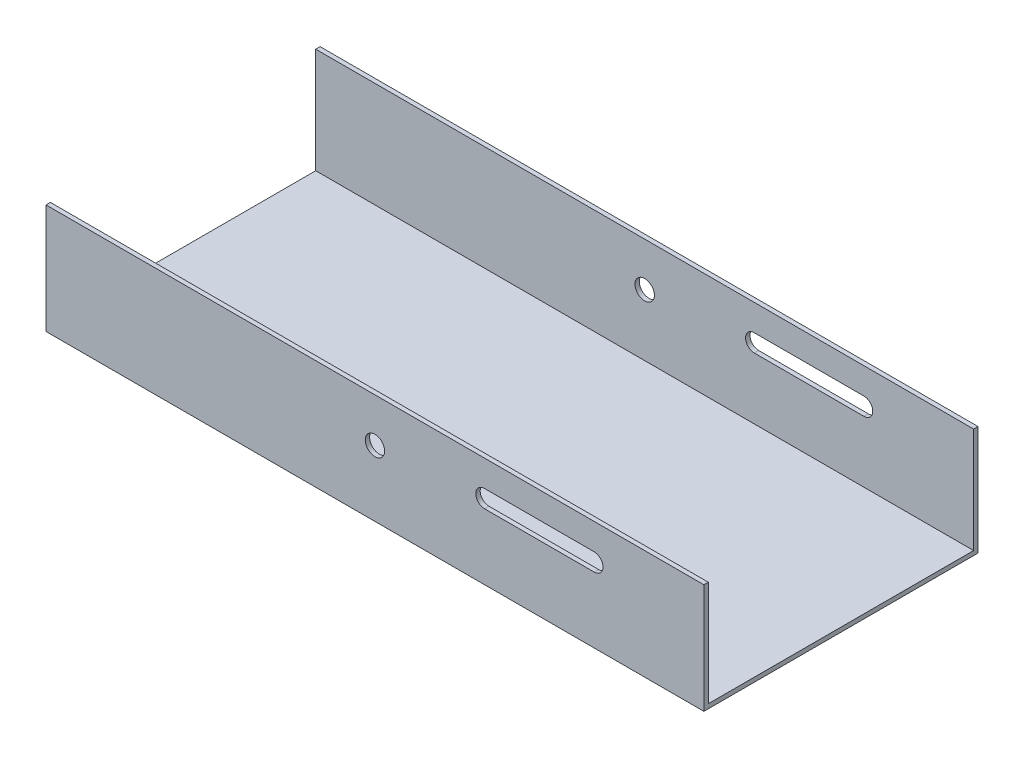
ISO-10303-21;
HEADER;
FILE_DESCRIPTION(('STEP AP214'),'2;1');
FILE_NAME('part.step','',(''),(''),'','','');
FILE_SCHEMA(('AUTOMOTIVE_DESIGN { 1 0 10303 214 1 1 1 1 }'));
ENDSEC;
DATA;
#1=APPLICATION_CONTEXT('core data for automotive mechanical design processes');
#2=APPLICATION_PROTOCOL_DEFINITION('international standard','automotive_design',2000,#1);
#3=PRODUCT_CONTEXT('',#1,'mechanical');
#4=PRODUCT('Part','Part','',(#3));
#5=PRODUCT_RELATED_PRODUCT_CATEGORY('part','',(#4));
#6=PRODUCT_DEFINITION_FORMATION('','',#4);
#7=PRODUCT_DEFINITION_CONTEXT('part definition',#1,'design');
#8=PRODUCT_DEFINITION('design','',#6,#7);
#9=PRODUCT_DEFINITION_SHAPE('','',#8);
#10=(LENGTH_UNIT() NAMED_UNIT(*) SI_UNIT(.MILLI.,.METRE.));
#11=(NAMED_UNIT(*) PLANE_ANGLE_UNIT() SI_UNIT($,.RADIAN.));
#12=(NAMED_UNIT(*) SI_UNIT($,.STERADIAN.) SOLID_ANGLE_UNIT());
#13=UNCERTAINTY_MEASURE_WITH_UNIT(LENGTH_MEASURE(1.E-05),#10,'distance_accuracy_value','');
#14=(GEOMETRIC_REPRESENTATION_CONTEXT(3) GLOBAL_UNCERTAINTY_ASSIGNED_CONTEXT((#13)) GLOBAL_UNIT_ASSIGNED_CONTEXT((#10,
#11,#12)) REPRESENTATION_CONTEXT('',''));
#15=CARTESIAN_POINT('',(0.,0.,0.));
#16=DIRECTION('',(0.,0.,1.));
#17=DIRECTION('',(1.,0.,0.));
#18=AXIS2_PLACEMENT_3D('',#15,#16,#17);
#19=CARTESIAN_POINT('',(0.,50.,0.));
#20=DIRECTION('',(0.,1.,0.));
#21=DIRECTION('',(0.,0.,1.));
#22=AXIS2_PLACEMENT_3D('',#19,#20,#21);
#23=PLANE('',#22);
#24=DIRECTION('',(-1.,0.,0.));
#25=VECTOR('',#24,1.);
#26=CARTESIAN_POINT('',(0.,50.,-123.));
#27=LINE('',#26,#25);
#28=CARTESIAN_POINT('',(0.,50.,-123.));
#29=VERTEX_POINT('',#28);
#30=CARTESIAN_POINT('',(-300.,50.,-123.));
#31=VERTEX_POINT('',#30);
#32=EDGE_CURVE('E212',#29,#31,#27,.T.);
#33=ORIENTED_EDGE('',*,*,#32,.F.);
#34=DIRECTION('',(0.,0.,-1.));
#35=VECTOR('',#34,1.);
#36=CARTESIAN_POINT('',(0.,50.,0.));
#37=LINE('',#36,#35);
#38=CARTESIAN_POINT('',(0.,50.,-125.));
#39=VERTEX_POINT('',#38);
#40=EDGE_CURVE('E236',#29,#39,#37,.T.);
#41=ORIENTED_EDGE('',*,*,#40,.T.);
#42=DIRECTION('',(-1.,0.,0.));
#43=VECTOR('',#42,1.);
#44=CARTESIAN_POINT('',(0.,50.,-125.));
#45=LINE('',#44,#43);
#46=CARTESIAN_POINT('',(-300.,50.,-125.));
#47=VERTEX_POINT('',#46);
#48=EDGE_CURVE('E235',#39,#47,#45,.T.);
#49=ORIENTED_EDGE('',*,*,#48,.T.);
#50=DIRECTION('',(0.,0.,1.));
#51=VECTOR('',#50,1.);
#52=CARTESIAN_POINT('',(-300.,50.,0.));
#53=LINE('',#52,#51);
#54=EDGE_CURVE('E239',#47,#31,#53,.T.);
#55=ORIENTED_EDGE('',*,*,#54,.T.);
#56=EDGE_LOOP('',(#33,#41,#49,#55));
#57=FACE_BOUND('',#56,.T.);
#58=ADVANCED_FACE('F37',(#57),#23,.T.);
#59=CARTESIAN_POINT('',(0.,50.,0.));
#60=DIRECTION('',(-1.,0.,0.));
#61=DIRECTION('',(0.,0.,1.));
#62=AXIS2_PLACEMENT_3D('',#59,#60,#61);
#63=PLANE('',#62);
#64=ORIENTED_EDGE('',*,*,#40,.F.);
#65=DIRECTION('',(0.,-1.,0.));
#66=VECTOR('',#65,1.);
#67=CARTESIAN_POINT('',(0.,50.,-123.));
#68=LINE('',#67,#66);
#69=CARTESIAN_POINT('',(0.,2.,-123.));
#70=VERTEX_POINT('',#69);
#71=EDGE_CURVE('E216',#29,#70,#68,.T.);
#72=ORIENTED_EDGE('',*,*,#71,.T.);
#73=DIRECTION('',(0.,0.,-1.));
#74=VECTOR('',#73,1.);
#75=CARTESIAN_POINT('',(0.,2.,0.));
#76=LINE('',#75,#74);
#77=CARTESIAN_POINT('',(0.,2.,-2.));
#78=VERTEX_POINT('',#77);
#79=EDGE_CURVE('E206',#78,#70,#76,.T.);
#80=ORIENTED_EDGE('',*,*,#79,.F.);
#81=DIRECTION('',(0.,-1.,0.));
#82=VECTOR('',#81,1.);
#83=CARTESIAN_POINT('',(0.,50.,-2.));
#84=LINE('',#83,#82);
#85=CARTESIAN_POINT('',(0.,50.,-2.));
#86=VERTEX_POINT('',#85);
#87=EDGE_CURVE('E221',#86,#78,#84,.T.);
#88=ORIENTED_EDGE('',*,*,#87,.F.);
#89=CARTESIAN_POINT('',(0.,50.,0.));
#90=VERTEX_POINT('',#89);
#91=EDGE_CURVE('E232',#90,#86,#37,.T.);
#92=ORIENTED_EDGE('',*,*,#91,.F.);
#93=DIRECTION('',(0.,-1.,0.));
#94=VECTOR('',#93,1.);
#95=CARTESIAN_POINT('',(0.,50.,0.));
#96=LINE('',#95,#94);
#97=CARTESIAN_POINT('',(0.,0.,0.));
#98=VERTEX_POINT('',#97);
#99=EDGE_CURVE('E244',#90,#98,#96,.T.);
#100=ORIENTED_EDGE('',*,*,#99,.T.);
#101=DIRECTION('',(0.,0.,-1.));
#102=VECTOR('',#101,1.);
#103=CARTESIAN_POINT('',(0.,0.,0.));
#104=LINE('',#103,#102);
#105=CARTESIAN_POINT('',(0.,0.,-125.));
#106=VERTEX_POINT('',#105);
#107=EDGE_CURVE('E230',#98,#106,#104,.T.);
#108=ORIENTED_EDGE('',*,*,#107,.T.);
#109=DIRECTION('',(0.,-1.,0.));
#110=VECTOR('',#109,1.);
#111=CARTESIAN_POINT('',(0.,50.,-125.));
#112=LINE('',#111,#110);
#113=EDGE_CURVE('E261',#39,#106,#112,.T.);
#114=ORIENTED_EDGE('',*,*,#113,.F.);
#115=EDGE_LOOP('',(#64,#72,#80,#88,#92,#100,#108,#114));
#116=FACE_BOUND('',#115,.T.);
#117=ADVANCED_FACE('F39',(#116),#63,.F.);
#118=CARTESIAN_POINT('',(0.,50.,-125.));
#119=DIRECTION('',(0.,0.,1.));
#120=DIRECTION('',(1.,0.,0.));
#121=AXIS2_PLACEMENT_3D('',#118,#119,#120);
#122=PLANE('',#121);
#123=CARTESIAN_POINT('',(-150.,30.,-125.));
#124=DIRECTION('',(0.,0.,1.));
#125=DIRECTION('',(1.,0.,0.));
#126=AXIS2_PLACEMENT_3D('',#123,#124,#125);
#127=CIRCLE('',#126,4.42375783482208);
#128=CARTESIAN_POINT('',(-145.576242165178,30.,-125.));
#129=VERTEX_POINT('',#128);
#130=EDGE_CURVE('E276',#129,#129,#127,.T.);
#131=ORIENTED_EDGE('',*,*,#130,.T.);
#132=EDGE_LOOP('',(#131));
#133=FACE_BOUND('',#132,.T.);
#134=DIRECTION('',(-1.,0.,0.));
#135=VECTOR('',#134,1.);
#136=CARTESIAN_POINT('',(0.,38.,-125.));
#137=LINE('',#136,#135);
#138=CARTESIAN_POINT('',(-50.,38.,-125.));
#139=VERTEX_POINT('',#138);
#140=CARTESIAN_POINT('',(-100.,38.,-125.));
#141=VERTEX_POINT('',#140);
#142=EDGE_CURVE('E197',#139,#141,#137,.T.);
#143=ORIENTED_EDGE('',*,*,#142,.T.);
#144=CARTESIAN_POINT('',(-100.,34.,-125.));
#145=DIRECTION('',(0.,0.,1.));
#146=DIRECTION('',(1.,0.,0.));
#147=AXIS2_PLACEMENT_3D('',#144,#145,#146);
#148=CIRCLE('',#147,4.00000000000001);
#149=CARTESIAN_POINT('',(-100.,30.,-125.));
#150=VERTEX_POINT('',#149);
#151=EDGE_CURVE('E203',#141,#150,#148,.T.);
#152=ORIENTED_EDGE('',*,*,#151,.T.);
#153=DIRECTION('',(1.,0.,0.));
#154=VECTOR('',#153,1.);
#155=CARTESIAN_POINT('',(0.,30.,-125.));
#156=LINE('',#155,#154);
#157=CARTESIAN_POINT('',(-50.,30.,-125.));
#158=VERTEX_POINT('',#157);
#159=EDGE_CURVE('E187',#150,#158,#156,.T.);
#160=ORIENTED_EDGE('',*,*,#159,.T.);
#161=CARTESIAN_POINT('',(-50.,34.,-125.));
#162=DIRECTION('',(0.,0.,1.));
#163=DIRECTION('',(1.,0.,0.));
#164=AXIS2_PLACEMENT_3D('',#161,#162,#163);
#165=CIRCLE('',#164,4.00000000000001);
#166=EDGE_CURVE('E192',#158,#139,#165,.T.);
#167=ORIENTED_EDGE('',*,*,#166,.T.);
#168=EDGE_LOOP('',(#143,#152,#160,#167));
#169=FACE_BOUND('',#168,.T.);
#170=DIRECTION('',(-1.,0.,0.));
#171=VECTOR('',#170,1.);
#172=CARTESIAN_POINT('',(0.,0.,-125.));
#173=LINE('',#172,#171);
#174=CARTESIAN_POINT('',(-300.,0.,-125.));
#175=VERTEX_POINT('',#174);
#176=EDGE_CURVE('E247',#106,#175,#173,.T.);
#177=ORIENTED_EDGE('',*,*,#176,.T.);
#178=DIRECTION('',(0.,-1.,0.));
#179=VECTOR('',#178,1.);
#180=CARTESIAN_POINT('',(-300.,50.,-125.));
#181=LINE('',#180,#179);
#182=EDGE_CURVE('E258',#47,#175,#181,.T.);
#183=ORIENTED_EDGE('',*,*,#182,.F.);
#184=ORIENTED_EDGE('',*,*,#48,.F.);
#185=ORIENTED_EDGE('',*,*,#113,.T.);
#186=EDGE_LOOP('',(#177,#183,#184,#185));
#187=FACE_BOUND('',#186,.T.);
#188=ADVANCED_FACE('F312',(#133,#169,#187),#122,.F.);
#189=CARTESIAN_POINT('',(-300.,50.,0.));
#190=DIRECTION('',(1.,0.,0.));
#191=DIRECTION('',(0.,0.,-1.));
#192=AXIS2_PLACEMENT_3D('',#189,#190,#191);
#193=PLANE('',#192);
#194=CARTESIAN_POINT('',(-300.,50.,-2.));
#195=VERTEX_POINT('',#194);
#196=CARTESIAN_POINT('',(-300.,50.,0.));
#197=VERTEX_POINT('',#196);
#198=EDGE_CURVE('E238',#195,#197,#53,.T.);
#199=ORIENTED_EDGE('',*,*,#198,.F.);
#200=DIRECTION('',(0.,-1.,0.));
#201=VECTOR('',#200,1.);
#202=CARTESIAN_POINT('',(-300.,50.,-2.));
#203=LINE('',#202,#201);
#204=CARTESIAN_POINT('',(-300.,2.,-2.));
#205=VERTEX_POINT('',#204);
#206=EDGE_CURVE('E217',#195,#205,#203,.T.);
#207=ORIENTED_EDGE('',*,*,#206,.T.);
#208=DIRECTION('',(0.,0.,1.));
#209=VECTOR('',#208,1.);
#210=CARTESIAN_POINT('',(-300.,2.,0.));
#211=LINE('',#210,#209);
#212=CARTESIAN_POINT('',(-300.,2.,-123.));
#213=VERTEX_POINT('',#212);
#214=EDGE_CURVE('E209',#213,#205,#211,.T.);
#215=ORIENTED_EDGE('',*,*,#214,.F.);
#216=DIRECTION('',(0.,-1.,0.));
#217=VECTOR('',#216,1.);
#218=CARTESIAN_POINT('',(-300.,50.,-123.));
#219=LINE('',#218,#217);
#220=EDGE_CURVE('E213',#31,#213,#219,.T.);
#221=ORIENTED_EDGE('',*,*,#220,.F.);
#222=ORIENTED_EDGE('',*,*,#54,.F.);
#223=ORIENTED_EDGE('',*,*,#182,.T.);
#224=DIRECTION('',(0.,0.,1.));
#225=VECTOR('',#224,1.);
#226=CARTESIAN_POINT('',(-300.,0.,0.));
#227=LINE('',#226,#225);
#228=CARTESIAN_POINT('',(-300.,0.,0.));
#229=VERTEX_POINT('',#228);
#230=EDGE_CURVE('E249',#175,#229,#227,.T.);
#231=ORIENTED_EDGE('',*,*,#230,.T.);
#232=DIRECTION('',(0.,-1.,0.));
#233=VECTOR('',#232,1.);
#234=CARTESIAN_POINT('',(-300.,50.,0.));
#235=LINE('',#234,#233);
#236=EDGE_CURVE('E255',#197,#229,#235,.T.);
#237=ORIENTED_EDGE('',*,*,#236,.F.);
#238=EDGE_LOOP('',(#199,#207,#215,#221,#222,#223,#231,#237));
#239=FACE_BOUND('',#238,.T.);
#240=ADVANCED_FACE('F323',(#239),#193,.F.);
#241=CARTESIAN_POINT('',(0.,50.,0.));
#242=DIRECTION('',(0.,0.,-1.));
#243=DIRECTION('',(-1.,0.,0.));
#244=AXIS2_PLACEMENT_3D('',#241,#242,#243);
#245=PLANE('',#244);
#246=CARTESIAN_POINT('',(-150.,30.,0.));
#247=DIRECTION('',(0.,0.,1.));
#248=DIRECTION('',(1.,0.,0.));
#249=AXIS2_PLACEMENT_3D('',#246,#247,#248);
#250=CIRCLE('',#249,4.42375783482208);
#251=CARTESIAN_POINT('',(-145.576242165178,30.,0.));
#252=VERTEX_POINT('',#251);
#253=EDGE_CURVE('E283',#252,#252,#250,.T.);
#254=ORIENTED_EDGE('',*,*,#253,.F.);
#255=EDGE_LOOP('',(#254));
#256=FACE_BOUND('',#255,.T.);
#257=DIRECTION('',(1.,0.,0.));
#258=VECTOR('',#257,1.);
#259=CARTESIAN_POINT('',(-100.,30.,0.));
#260=LINE('',#259,#258);
#261=CARTESIAN_POINT('',(-100.,30.,0.));
#262=VERTEX_POINT('',#261);
#263=CARTESIAN_POINT('',(-50.,30.,0.));
#264=VERTEX_POINT('',#263);
#265=EDGE_CURVE('E165',#262,#264,#260,.T.);
#266=ORIENTED_EDGE('',*,*,#265,.F.);
#267=CARTESIAN_POINT('',(-100.,34.,0.));
#268=DIRECTION('',(0.,0.,1.));
#269=DIRECTION('',(1.,0.,0.));
#270=AXIS2_PLACEMENT_3D('',#267,#268,#269);
#271=CIRCLE('',#270,4.00000000000001);
#272=CARTESIAN_POINT('',(-100.,38.,0.));
#273=VERTEX_POINT('',#272);
#274=EDGE_CURVE('E61',#273,#262,#271,.T.);
#275=ORIENTED_EDGE('',*,*,#274,.F.);
#276=DIRECTION('',(-1.,0.,0.));
#277=VECTOR('',#276,1.);
#278=CARTESIAN_POINT('',(-100.,38.,0.));
#279=LINE('',#278,#277);
#280=CARTESIAN_POINT('',(-50.,38.,0.));
#281=VERTEX_POINT('',#280);
#282=EDGE_CURVE('E173',#281,#273,#279,.T.);
#283=ORIENTED_EDGE('',*,*,#282,.F.);
#284=CARTESIAN_POINT('',(-50.,34.,0.));
#285=DIRECTION('',(0.,0.,1.));
#286=DIRECTION('',(1.,0.,0.));
#287=AXIS2_PLACEMENT_3D('',#284,#285,#286);
#288=CIRCLE('',#287,4.00000000000001);
#289=EDGE_CURVE('E156',#264,#281,#288,.T.);
#290=ORIENTED_EDGE('',*,*,#289,.F.);
#291=EDGE_LOOP('',(#266,#275,#283,#290));
#292=FACE_BOUND('',#291,.T.);
#293=DIRECTION('',(1.,0.,0.));
#294=VECTOR('',#293,1.);
#295=CARTESIAN_POINT('',(0.,0.,0.));
#296=LINE('',#295,#294);
#297=EDGE_CURVE('E251',#229,#98,#296,.T.);
#298=ORIENTED_EDGE('',*,*,#297,.T.);
#299=ORIENTED_EDGE('',*,*,#99,.F.);
#300=DIRECTION('',(1.,0.,0.));
#301=VECTOR('',#300,1.);
#302=CARTESIAN_POINT('',(0.,50.,0.));
#303=LINE('',#302,#301);
#304=EDGE_CURVE('E242',#197,#90,#303,.T.);
#305=ORIENTED_EDGE('',*,*,#304,.F.);
#306=ORIENTED_EDGE('',*,*,#236,.T.);
#307=EDGE_LOOP('',(#298,#299,#305,#306));
#308=FACE_BOUND('',#307,.T.);
#309=ADVANCED_FACE('F170',(#256,#292,#308),#245,.F.);
#310=DIRECTION('',(1.,0.,0.));
#311=VECTOR('',#310,1.);
#312=CARTESIAN_POINT('',(0.,50.,-2.));
#313=LINE('',#312,#311);
#314=EDGE_CURVE('E222',#195,#86,#313,.T.);
#315=ORIENTED_EDGE('',*,*,#314,.F.);
#316=ORIENTED_EDGE('',*,*,#198,.T.);
#317=ORIENTED_EDGE('',*,*,#304,.T.);
#318=ORIENTED_EDGE('',*,*,#91,.T.);
#319=EDGE_LOOP('',(#315,#316,#317,#318));
#320=FACE_BOUND('',#319,.T.);
#321=ADVANCED_FACE('F308',(#320),#23,.T.);
#322=CARTESIAN_POINT('',(0.,0.,0.));
#323=DIRECTION('',(0.,1.,0.));
#324=DIRECTION('',(0.,0.,1.));
#325=AXIS2_PLACEMENT_3D('',#322,#323,#324);
#326=PLANE('',#325);
#327=ORIENTED_EDGE('',*,*,#107,.F.);
#328=ORIENTED_EDGE('',*,*,#297,.F.);
#329=ORIENTED_EDGE('',*,*,#230,.F.);
#330=ORIENTED_EDGE('',*,*,#176,.F.);
#331=EDGE_LOOP('',(#327,#328,#329,#330));
#332=FACE_BOUND('',#331,.T.);
#333=ADVANCED_FACE('F302',(#332),#326,.F.);
#334=CARTESIAN_POINT('',(0.,50.,-123.));
#335=DIRECTION('',(0.,0.,1.));
#336=DIRECTION('',(1.,0.,0.));
#337=AXIS2_PLACEMENT_3D('',#334,#335,#336);
#338=PLANE('',#337);
#339=CARTESIAN_POINT('',(-150.,30.,-123.));
#340=DIRECTION('',(0.,0.,1.));
#341=DIRECTION('',(1.,0.,0.));
#342=AXIS2_PLACEMENT_3D('',#339,#340,#341);
#343=CIRCLE('',#342,4.42375783482208);
#344=CARTESIAN_POINT('',(-145.576242165178,30.,-123.));
#345=VERTEX_POINT('',#344);
#346=EDGE_CURVE('E278',#345,#345,#343,.T.);
#347=ORIENTED_EDGE('',*,*,#346,.F.);
#348=EDGE_LOOP('',(#347));
#349=FACE_BOUND('',#348,.T.);
#350=CARTESIAN_POINT('',(-100.,34.,-123.));
#351=DIRECTION('',(0.,0.,1.));
#352=DIRECTION('',(1.,0.,0.));
#353=AXIS2_PLACEMENT_3D('',#350,#351,#352);
#354=CIRCLE('',#353,4.00000000000001);
#355=CARTESIAN_POINT('',(-100.,38.,-123.));
#356=VERTEX_POINT('',#355);
#357=CARTESIAN_POINT('',(-100.,30.,-123.));
#358=VERTEX_POINT('',#357);
#359=EDGE_CURVE('E200',#356,#358,#354,.T.);
#360=ORIENTED_EDGE('',*,*,#359,.F.);
#361=DIRECTION('',(-1.,0.,0.));
#362=VECTOR('',#361,1.);
#363=CARTESIAN_POINT('',(0.,38.,-123.));
#364=LINE('',#363,#362);
#365=CARTESIAN_POINT('',(-50.,38.,-123.));
#366=VERTEX_POINT('',#365);
#367=EDGE_CURVE('E195',#366,#356,#364,.T.);
#368=ORIENTED_EDGE('',*,*,#367,.F.);
#369=CARTESIAN_POINT('',(-50.,34.,-123.));
#370=DIRECTION('',(0.,0.,1.));
#371=DIRECTION('',(1.,0.,0.));
#372=AXIS2_PLACEMENT_3D('',#369,#370,#371);
#373=CIRCLE('',#372,4.00000000000001);
#374=CARTESIAN_POINT('',(-50.,30.,-123.));
#375=VERTEX_POINT('',#374);
#376=EDGE_CURVE('E190',#375,#366,#373,.T.);
#377=ORIENTED_EDGE('',*,*,#376,.F.);
#378=DIRECTION('',(1.,0.,0.));
#379=VECTOR('',#378,1.);
#380=CARTESIAN_POINT('',(0.,30.,-123.));
#381=LINE('',#380,#379);
#382=EDGE_CURVE('E185',#358,#375,#381,.T.);
#383=ORIENTED_EDGE('',*,*,#382,.F.);
#384=EDGE_LOOP('',(#360,#368,#377,#383));
#385=FACE_BOUND('',#384,.T.);
#386=DIRECTION('',(-1.,0.,0.));
#387=VECTOR('',#386,1.);
#388=CARTESIAN_POINT('',(0.,2.,-123.));
#389=LINE('',#388,#387);
#390=EDGE_CURVE('E207',#70,#213,#389,.T.);
#391=ORIENTED_EDGE('',*,*,#390,.F.);
#392=ORIENTED_EDGE('',*,*,#71,.F.);
#393=ORIENTED_EDGE('',*,*,#32,.T.);
#394=ORIENTED_EDGE('',*,*,#220,.T.);
#395=EDGE_LOOP('',(#391,#392,#393,#394));
#396=FACE_BOUND('',#395,.T.);
#397=ADVANCED_FACE('F294',(#349,#385,#396),#338,.T.);
#398=CARTESIAN_POINT('',(0.,50.,-2.));
#399=DIRECTION('',(0.,0.,-1.));
#400=DIRECTION('',(-1.,0.,0.));
#401=AXIS2_PLACEMENT_3D('',#398,#399,#400);
#402=PLANE('',#401);
#403=CARTESIAN_POINT('',(-150.,30.,-2.));
#404=DIRECTION('',(0.,0.,-1.));
#405=DIRECTION('',(-1.,0.,0.));
#406=AXIS2_PLACEMENT_3D('',#403,#404,#405);
#407=CIRCLE('',#406,4.42375783482208);
#408=CARTESIAN_POINT('',(-154.423757834822,30.,-2.));
#409=VERTEX_POINT('',#408);
#410=EDGE_CURVE('E41',#409,#409,#407,.T.);
#411=ORIENTED_EDGE('',*,*,#410,.F.);
#412=EDGE_LOOP('',(#411));
#413=FACE_BOUND('',#412,.T.);
#414=CARTESIAN_POINT('',(-100.,34.,-2.));
#415=DIRECTION('',(0.,0.,-1.));
#416=DIRECTION('',(-1.,0.,0.));
#417=AXIS2_PLACEMENT_3D('',#414,#415,#416);
#418=CIRCLE('',#417,4.00000000000001);
#419=CARTESIAN_POINT('',(-100.,30.,-2.));
#420=VERTEX_POINT('',#419);
#421=CARTESIAN_POINT('',(-100.,38.,-2.));
#422=VERTEX_POINT('',#421);
#423=EDGE_CURVE('E11',#420,#422,#418,.T.);
#424=ORIENTED_EDGE('',*,*,#423,.F.);
#425=DIRECTION('',(-1.,0.,0.));
#426=VECTOR('',#425,1.);
#427=CARTESIAN_POINT('',(0.,30.,-2.));
#428=LINE('',#427,#426);
#429=CARTESIAN_POINT('',(-50.,30.,-2.));
#430=VERTEX_POINT('',#429);
#431=EDGE_CURVE('E264',#430,#420,#428,.T.);
#432=ORIENTED_EDGE('',*,*,#431,.F.);
#433=CARTESIAN_POINT('',(-50.,34.,-2.));
#434=DIRECTION('',(0.,0.,-1.));
#435=DIRECTION('',(-1.,0.,0.));
#436=AXIS2_PLACEMENT_3D('',#433,#434,#435);
#437=CIRCLE('',#436,4.00000000000001);
#438=CARTESIAN_POINT('',(-50.,38.,-2.));
#439=VERTEX_POINT('',#438);
#440=EDGE_CURVE('E159',#439,#430,#437,.T.);
#441=ORIENTED_EDGE('',*,*,#440,.F.);
#442=DIRECTION('',(1.,0.,0.));
#443=VECTOR('',#442,1.);
#444=CARTESIAN_POINT('',(0.,38.,-2.));
#445=LINE('',#444,#443);
#446=EDGE_CURVE('E46',#422,#439,#445,.T.);
#447=ORIENTED_EDGE('',*,*,#446,.F.);
#448=EDGE_LOOP('',(#424,#432,#441,#447));
#449=FACE_BOUND('',#448,.T.);
#450=DIRECTION('',(1.,0.,0.));
#451=VECTOR('',#450,1.);
#452=CARTESIAN_POINT('',(0.,2.,-2.));
#453=LINE('',#452,#451);
#454=EDGE_CURVE('E210',#205,#78,#453,.T.);
#455=ORIENTED_EDGE('',*,*,#454,.F.);
#456=ORIENTED_EDGE('',*,*,#206,.F.);
#457=ORIENTED_EDGE('',*,*,#314,.T.);
#458=ORIENTED_EDGE('',*,*,#87,.T.);
#459=EDGE_LOOP('',(#455,#456,#457,#458));
#460=FACE_BOUND('',#459,.T.);
#461=ADVANCED_FACE('F273',(#413,#449,#460),#402,.T.);
#462=CARTESIAN_POINT('',(0.,2.,0.));
#463=DIRECTION('',(0.,1.,0.));
#464=DIRECTION('',(0.,0.,1.));
#465=AXIS2_PLACEMENT_3D('',#462,#463,#464);
#466=PLANE('',#465);
#467=ORIENTED_EDGE('',*,*,#79,.T.);
#468=ORIENTED_EDGE('',*,*,#390,.T.);
#469=ORIENTED_EDGE('',*,*,#214,.T.);
#470=ORIENTED_EDGE('',*,*,#454,.T.);
#471=EDGE_LOOP('',(#467,#468,#469,#470));
#472=FACE_BOUND('',#471,.T.);
#473=ADVANCED_FACE('F293',(#472),#466,.T.);
#474=CARTESIAN_POINT('',(-100.,30.,-142.));
#475=DIRECTION('',(0.,-1.,0.));
#476=DIRECTION('',(0.,0.,-1.));
#477=AXIS2_PLACEMENT_3D('',#474,#475,#476);
#478=PLANE('',#477);
#479=ORIENTED_EDGE('',*,*,#431,.T.);
#480=DIRECTION('',(0.,0.,1.));
#481=VECTOR('',#480,1.);
#482=CARTESIAN_POINT('',(-100.,30.,-142.));
#483=LINE('',#482,#481);
#484=EDGE_CURVE('E167',#420,#262,#483,.T.);
#485=ORIENTED_EDGE('',*,*,#484,.T.);
#486=ORIENTED_EDGE('',*,*,#265,.T.);
#487=DIRECTION('',(0.,0.,1.));
#488=VECTOR('',#487,1.);
#489=CARTESIAN_POINT('',(-50.,30.,-142.));
#490=LINE('',#489,#488);
#491=EDGE_CURVE('E151',#430,#264,#490,.T.);
#492=ORIENTED_EDGE('',*,*,#491,.F.);
#493=EDGE_LOOP('',(#479,#485,#486,#492));
#494=FACE_BOUND('',#493,.T.);
#495=ADVANCED_FACE('F166',(#494),#478,.F.);
#496=CARTESIAN_POINT('',(-50.,34.,-142.));
#497=DIRECTION('',(0.,0.,1.));
#498=DIRECTION('',(1.,0.,0.));
#499=AXIS2_PLACEMENT_3D('',#496,#497,#498);
#500=CYLINDRICAL_SURFACE('',#499,4.00000000000001);
#501=ORIENTED_EDGE('',*,*,#440,.T.);
#502=ORIENTED_EDGE('',*,*,#491,.T.);
#503=ORIENTED_EDGE('',*,*,#289,.T.);
#504=DIRECTION('',(0.,0.,1.));
#505=VECTOR('',#504,1.);
#506=CARTESIAN_POINT('',(-50.,38.,-142.));
#507=LINE('',#506,#505);
#508=EDGE_CURVE('E182',#439,#281,#507,.T.);
#509=ORIENTED_EDGE('',*,*,#508,.F.);
#510=EDGE_LOOP('',(#501,#502,#503,#509));
#511=FACE_BOUND('',#510,.T.);
#512=ADVANCED_FACE('F153',(#511),#500,.F.);
#513=CARTESIAN_POINT('',(-100.,38.,-142.));
#514=DIRECTION('',(0.,1.,0.));
#515=DIRECTION('',(0.,0.,1.));
#516=AXIS2_PLACEMENT_3D('',#513,#514,#515);
#517=PLANE('',#516);
#518=ORIENTED_EDGE('',*,*,#446,.T.);
#519=ORIENTED_EDGE('',*,*,#508,.T.);
#520=ORIENTED_EDGE('',*,*,#282,.T.);
#521=DIRECTION('',(0.,0.,1.));
#522=VECTOR('',#521,1.);
#523=CARTESIAN_POINT('',(-100.,38.,-142.));
#524=LINE('',#523,#522);
#525=EDGE_CURVE('E178',#422,#273,#524,.T.);
#526=ORIENTED_EDGE('',*,*,#525,.F.);
#527=EDGE_LOOP('',(#518,#519,#520,#526));
#528=FACE_BOUND('',#527,.T.);
#529=ADVANCED_FACE('F270',(#528),#517,.F.);
#530=CARTESIAN_POINT('',(-100.,34.,-142.));
#531=DIRECTION('',(0.,0.,1.));
#532=DIRECTION('',(1.,0.,0.));
#533=AXIS2_PLACEMENT_3D('',#530,#531,#532);
#534=CYLINDRICAL_SURFACE('',#533,4.00000000000001);
#535=ORIENTED_EDGE('',*,*,#423,.T.);
#536=ORIENTED_EDGE('',*,*,#525,.T.);
#537=ORIENTED_EDGE('',*,*,#274,.T.);
#538=ORIENTED_EDGE('',*,*,#484,.F.);
#539=EDGE_LOOP('',(#535,#536,#537,#538));
#540=FACE_BOUND('',#539,.T.);
#541=ADVANCED_FACE('F275',(#540),#534,.F.);
#542=EDGE_CURVE('E180',#141,#356,#524,.T.);
#543=ORIENTED_EDGE('',*,*,#542,.T.);
#544=ORIENTED_EDGE('',*,*,#359,.T.);
#545=EDGE_CURVE('E162',#150,#358,#483,.T.);
#546=ORIENTED_EDGE('',*,*,#545,.F.);
#547=ORIENTED_EDGE('',*,*,#151,.F.);
#548=EDGE_LOOP('',(#543,#544,#546,#547));
#549=FACE_BOUND('',#548,.T.);
#550=ADVANCED_FACE('F370',(#549),#534,.F.);
#551=EDGE_CURVE('E181',#139,#366,#507,.T.);
#552=ORIENTED_EDGE('',*,*,#551,.T.);
#553=ORIENTED_EDGE('',*,*,#367,.T.);
#554=ORIENTED_EDGE('',*,*,#542,.F.);
#555=ORIENTED_EDGE('',*,*,#142,.F.);
#556=EDGE_LOOP('',(#552,#553,#554,#555));
#557=FACE_BOUND('',#556,.T.);
#558=ADVANCED_FACE('F360',(#557),#517,.F.);
#559=EDGE_CURVE('E53',#158,#375,#490,.T.);
#560=ORIENTED_EDGE('',*,*,#559,.T.);
#561=ORIENTED_EDGE('',*,*,#376,.T.);
#562=ORIENTED_EDGE('',*,*,#551,.F.);
#563=ORIENTED_EDGE('',*,*,#166,.F.);
#564=EDGE_LOOP('',(#560,#561,#562,#563));
#565=FACE_BOUND('',#564,.T.);
#566=ADVANCED_FACE('F364',(#565),#500,.F.);
#567=ORIENTED_EDGE('',*,*,#545,.T.);
#568=ORIENTED_EDGE('',*,*,#382,.T.);
#569=ORIENTED_EDGE('',*,*,#559,.F.);
#570=ORIENTED_EDGE('',*,*,#159,.F.);
#571=EDGE_LOOP('',(#567,#568,#569,#570));
#572=FACE_BOUND('',#571,.T.);
#573=ADVANCED_FACE('F372',(#572),#478,.F.);
#574=CARTESIAN_POINT('',(-150.,30.,-132.));
#575=DIRECTION('',(0.,0.,1.));
#576=DIRECTION('',(1.,0.,0.));
#577=AXIS2_PLACEMENT_3D('',#574,#575,#576);
#578=CYLINDRICAL_SURFACE('',#577,4.42375783482208);
#579=ORIENTED_EDGE('',*,*,#410,.T.);
#580=EDGE_LOOP('',(#579));
#581=FACE_BOUND('',#580,.T.);
#582=ORIENTED_EDGE('',*,*,#253,.T.);
#583=EDGE_LOOP('',(#582));
#584=FACE_BOUND('',#583,.T.);
#585=ADVANCED_FACE('F290',(#581,#584),#578,.F.);
#586=ORIENTED_EDGE('',*,*,#346,.T.);
#587=EDGE_LOOP('',(#586));
#588=FACE_BOUND('',#587,.T.);
#589=ORIENTED_EDGE('',*,*,#130,.F.);
#590=EDGE_LOOP('',(#589));
#591=FACE_BOUND('',#590,.T.);
#592=ADVANCED_FACE('F379',(#588,#591),#578,.F.);
#593=CLOSED_SHELL('',(#58,#117,#188,#240,#309,#321,#333,#397,#461,#473,#495,#512,#529,#541,#550,
#558,#566,#573,#585,#592));
#594=MANIFOLD_SOLID_BREP('B2',#593);
#595=ADVANCED_BREP_SHAPE_REPRESENTATION('',(#18,#594),#14);
#596=SHAPE_DEFINITION_REPRESENTATION(#9,#595);
ENDSEC;
END-ISO-10303-21;
